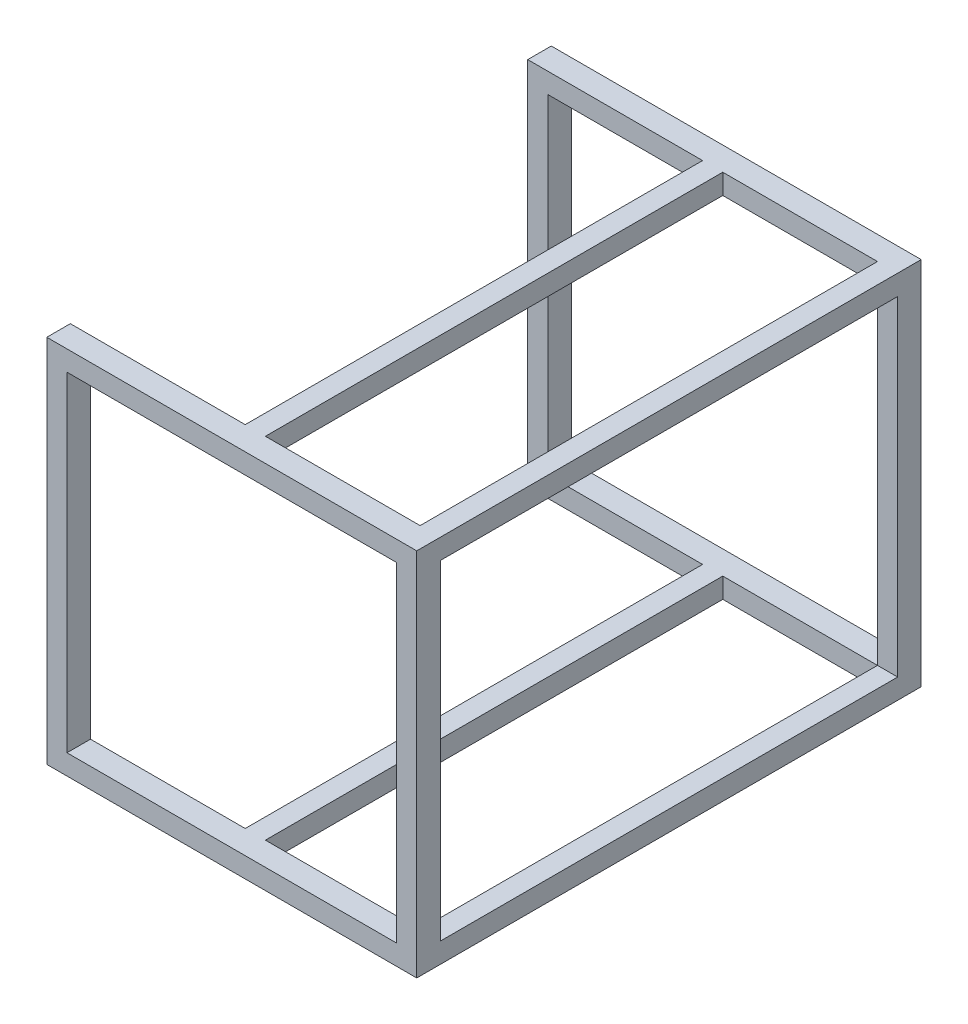
ISO-10303-21;
HEADER;
FILE_DESCRIPTION(('STEP AP214'),'2;1');
FILE_NAME('part.step','',(''),(''),'','','');
FILE_SCHEMA(('AUTOMOTIVE_DESIGN { 1 0 10303 214 1 1 1 1 }'));
ENDSEC;
DATA;
#1=APPLICATION_CONTEXT('core data for automotive mechanical design processes');
#2=APPLICATION_PROTOCOL_DEFINITION('international standard','automotive_design',2000,#1);
#3=PRODUCT_CONTEXT('',#1,'mechanical');
#4=PRODUCT('Part','Part','',(#3));
#5=PRODUCT_RELATED_PRODUCT_CATEGORY('part','',(#4));
#6=PRODUCT_DEFINITION_FORMATION('','',#4);
#7=PRODUCT_DEFINITION_CONTEXT('part definition',#1,'design');
#8=PRODUCT_DEFINITION('design','',#6,#7);
#9=PRODUCT_DEFINITION_SHAPE('','',#8);
#10=(LENGTH_UNIT() NAMED_UNIT(*) SI_UNIT(.MILLI.,.METRE.));
#11=(NAMED_UNIT(*) PLANE_ANGLE_UNIT() SI_UNIT($,.RADIAN.));
#12=(NAMED_UNIT(*) SI_UNIT($,.STERADIAN.) SOLID_ANGLE_UNIT());
#13=UNCERTAINTY_MEASURE_WITH_UNIT(LENGTH_MEASURE(1.E-05),#10,'distance_accuracy_value','');
#14=(GEOMETRIC_REPRESENTATION_CONTEXT(3) GLOBAL_UNCERTAINTY_ASSIGNED_CONTEXT((#13)) GLOBAL_UNIT_ASSIGNED_CONTEXT((#10,
#11,#12)) REPRESENTATION_CONTEXT('',''));
#15=CARTESIAN_POINT('',(0.,0.,0.));
#16=DIRECTION('',(0.,0.,1.));
#17=DIRECTION('',(1.,0.,0.));
#18=AXIS2_PLACEMENT_3D('',#15,#16,#17);
#19=CARTESIAN_POINT('',(49.,49.,0.));
#20=DIRECTION('',(-1.,0.,0.));
#21=DIRECTION('',(0.,0.,1.));
#22=AXIS2_PLACEMENT_3D('',#19,#20,#21);
#23=PLANE('',#22);
#24=DIRECTION('',(0.,0.,-1.));
#25=VECTOR('',#24,1.);
#26=CARTESIAN_POINT('',(49.,55.,0.));
#27=LINE('',#26,#25);
#28=CARTESIAN_POINT('',(49.,55.,143.));
#29=VERTEX_POINT('',#28);
#30=CARTESIAN_POINT('',(49.,55.,7.));
#31=VERTEX_POINT('',#30);
#32=EDGE_CURVE('E225',#29,#31,#27,.T.);
#33=ORIENTED_EDGE('',*,*,#32,.T.);
#34=DIRECTION('',(0.,1.,0.));
#35=VECTOR('',#34,1.);
#36=CARTESIAN_POINT('',(49.,0.,7.));
#37=LINE('',#36,#35);
#38=CARTESIAN_POINT('',(49.,49.,7.));
#39=VERTEX_POINT('',#38);
#40=EDGE_CURVE('E213',#39,#31,#37,.T.);
#41=ORIENTED_EDGE('',*,*,#40,.F.);
#42=DIRECTION('',(0.,0.,-1.));
#43=VECTOR('',#42,1.);
#44=CARTESIAN_POINT('',(49.,49.,0.));
#45=LINE('',#44,#43);
#46=CARTESIAN_POINT('',(49.,49.,143.));
#47=VERTEX_POINT('',#46);
#48=EDGE_CURVE('E194',#47,#39,#45,.T.);
#49=ORIENTED_EDGE('',*,*,#48,.F.);
#50=DIRECTION('',(0.,1.,0.));
#51=VECTOR('',#50,1.);
#52=CARTESIAN_POINT('',(49.,0.,143.));
#53=LINE('',#52,#51);
#54=EDGE_CURVE('E22',#47,#29,#53,.T.);
#55=ORIENTED_EDGE('',*,*,#54,.T.);
#56=EDGE_LOOP('',(#33,#41,#49,#55));
#57=FACE_BOUND('',#56,.T.);
#58=ADVANCED_FACE('F19',(#57),#23,.T.);
#59=CARTESIAN_POINT('',(3.,-55.,143.));
#60=DIRECTION('',(-1.,0.,0.));
#61=DIRECTION('',(0.,0.,1.));
#62=AXIS2_PLACEMENT_3D('',#59,#60,#61);
#63=PLANE('',#62);
#64=DIRECTION('',(0.,0.,-1.));
#65=VECTOR('',#64,1.);
#66=CARTESIAN_POINT('',(3.,55.,0.));
#67=LINE('',#66,#65);
#68=CARTESIAN_POINT('',(3.,55.,7.));
#69=VERTEX_POINT('',#68);
#70=CARTESIAN_POINT('',(3.,55.,143.));
#71=VERTEX_POINT('',#70);
#72=EDGE_CURVE('E250',#69,#71,#67,.F.);
#73=ORIENTED_EDGE('',*,*,#72,.T.);
#74=DIRECTION('',(0.,1.,0.));
#75=VECTOR('',#74,1.);
#76=CARTESIAN_POINT('',(3.,0.,143.));
#77=LINE('',#76,#75);
#78=CARTESIAN_POINT('',(3.,49.,143.));
#79=VERTEX_POINT('',#78);
#80=EDGE_CURVE('E227',#71,#79,#77,.F.);
#81=ORIENTED_EDGE('',*,*,#80,.T.);
#82=DIRECTION('',(0.,0.,-1.));
#83=VECTOR('',#82,1.);
#84=CARTESIAN_POINT('',(3.,49.,0.));
#85=LINE('',#84,#83);
#86=CARTESIAN_POINT('',(3.,49.,7.));
#87=VERTEX_POINT('',#86);
#88=EDGE_CURVE('E425',#87,#79,#85,.F.);
#89=ORIENTED_EDGE('',*,*,#88,.F.);
#90=DIRECTION('',(0.,1.,0.));
#91=VECTOR('',#90,1.);
#92=CARTESIAN_POINT('',(3.,0.,7.));
#93=LINE('',#92,#91);
#94=EDGE_CURVE('E206',#69,#87,#93,.F.);
#95=ORIENTED_EDGE('',*,*,#94,.F.);
#96=EDGE_LOOP('',(#73,#81,#89,#95));
#97=FACE_BOUND('',#96,.T.);
#98=ADVANCED_FACE('F573',(#97),#63,.F.);
#99=CARTESIAN_POINT('',(0.,0.,143.));
#100=DIRECTION('',(0.,0.,1.));
#101=DIRECTION('',(1.,0.,0.));
#102=AXIS2_PLACEMENT_3D('',#99,#100,#101);
#103=PLANE('',#102);
#104=DIRECTION('',(1.,0.,0.));
#105=VECTOR('',#104,1.);
#106=CARTESIAN_POINT('',(-55.,55.,143.));
#107=LINE('',#106,#105);
#108=EDGE_CURVE('E434',#71,#29,#107,.T.);
#109=ORIENTED_EDGE('',*,*,#108,.T.);
#110=ORIENTED_EDGE('',*,*,#54,.F.);
#111=DIRECTION('',(1.,0.,0.));
#112=VECTOR('',#111,1.);
#113=CARTESIAN_POINT('',(-49.,49.,143.));
#114=LINE('',#113,#112);
#115=EDGE_CURVE('E421',#79,#47,#114,.T.);
#116=ORIENTED_EDGE('',*,*,#115,.F.);
#117=ORIENTED_EDGE('',*,*,#80,.F.);
#118=EDGE_LOOP('',(#109,#110,#116,#117));
#119=FACE_BOUND('',#118,.T.);
#120=ADVANCED_FACE('F578',(#119),#103,.F.);
#121=CARTESIAN_POINT('',(0.,0.,7.));
#122=DIRECTION('',(0.,0.,1.));
#123=DIRECTION('',(1.,0.,0.));
#124=AXIS2_PLACEMENT_3D('',#121,#122,#123);
#125=PLANE('',#124);
#126=DIRECTION('',(1.,0.,0.));
#127=VECTOR('',#126,1.);
#128=CARTESIAN_POINT('',(-55.,55.,7.));
#129=LINE('',#128,#127);
#130=EDGE_CURVE('E428',#31,#69,#129,.F.);
#131=ORIENTED_EDGE('',*,*,#130,.T.);
#132=ORIENTED_EDGE('',*,*,#94,.T.);
#133=DIRECTION('',(1.,0.,0.));
#134=VECTOR('',#133,1.);
#135=CARTESIAN_POINT('',(-49.,49.,7.));
#136=LINE('',#135,#134);
#137=EDGE_CURVE('E210',#39,#87,#136,.F.);
#138=ORIENTED_EDGE('',*,*,#137,.F.);
#139=ORIENTED_EDGE('',*,*,#40,.T.);
#140=EDGE_LOOP('',(#131,#132,#138,#139));
#141=FACE_BOUND('',#140,.T.);
#142=ADVANCED_FACE('F212',(#141),#125,.T.);
#143=CARTESIAN_POINT('',(49.,49.,0.));
#144=DIRECTION('',(-1.,0.,0.));
#145=DIRECTION('',(0.,0.,1.));
#146=AXIS2_PLACEMENT_3D('',#143,#144,#145);
#147=PLANE('',#146);
#148=DIRECTION('',(0.,0.,-1.));
#149=VECTOR('',#148,1.);
#150=CARTESIAN_POINT('',(49.,49.,0.));
#151=LINE('',#150,#149);
#152=CARTESIAN_POINT('',(49.,49.,150.));
#153=VERTEX_POINT('',#152);
#154=EDGE_CURVE('E418',#47,#153,#151,.F.);
#155=ORIENTED_EDGE('',*,*,#154,.F.);
#156=DIRECTION('',(0.,1.,0.));
#157=VECTOR('',#156,1.);
#158=CARTESIAN_POINT('',(49.,0.,143.));
#159=LINE('',#158,#157);
#160=CARTESIAN_POINT('',(49.,-49.,143.));
#161=VERTEX_POINT('',#160);
#162=EDGE_CURVE('E251',#47,#161,#159,.F.);
#163=ORIENTED_EDGE('',*,*,#162,.T.);
#164=DIRECTION('',(0.,0.,1.));
#165=VECTOR('',#164,1.);
#166=CARTESIAN_POINT('',(49.,-49.,0.));
#167=LINE('',#166,#165);
#168=CARTESIAN_POINT('',(49.,-49.,150.));
#169=VERTEX_POINT('',#168);
#170=EDGE_CURVE('E447',#169,#161,#167,.F.);
#171=ORIENTED_EDGE('',*,*,#170,.F.);
#172=DIRECTION('',(0.,1.,0.));
#173=VECTOR('',#172,1.);
#174=CARTESIAN_POINT('',(49.,0.,150.));
#175=LINE('',#174,#173);
#176=EDGE_CURVE('E381',#153,#169,#175,.F.);
#177=ORIENTED_EDGE('',*,*,#176,.F.);
#178=EDGE_LOOP('',(#155,#163,#171,#177));
#179=FACE_BOUND('',#178,.T.);
#180=ADVANCED_FACE('F445',(#179),#147,.T.);
#181=CARTESIAN_POINT('',(0.,0.,7.));
#182=DIRECTION('',(0.,0.,1.));
#183=DIRECTION('',(1.,0.,0.));
#184=AXIS2_PLACEMENT_3D('',#181,#182,#183);
#185=PLANE('',#184);
#186=DIRECTION('',(0.,1.,0.));
#187=VECTOR('',#186,1.);
#188=CARTESIAN_POINT('',(49.,49.,7.));
#189=LINE('',#188,#187);
#190=CARTESIAN_POINT('',(49.,-49.,7.));
#191=VERTEX_POINT('',#190);
#192=EDGE_CURVE('E242',#191,#39,#189,.T.);
#193=ORIENTED_EDGE('',*,*,#192,.F.);
#194=DIRECTION('',(1.,0.,0.));
#195=VECTOR('',#194,1.);
#196=CARTESIAN_POINT('',(49.,-49.,7.));
#197=LINE('',#196,#195);
#198=CARTESIAN_POINT('',(55.,-49.,7.));
#199=VERTEX_POINT('',#198);
#200=EDGE_CURVE('E466',#199,#191,#197,.F.);
#201=ORIENTED_EDGE('',*,*,#200,.F.);
#202=DIRECTION('',(0.,1.,0.));
#203=VECTOR('',#202,1.);
#204=CARTESIAN_POINT('',(55.,55.,7.));
#205=LINE('',#204,#203);
#206=CARTESIAN_POINT('',(55.,49.,7.));
#207=VERTEX_POINT('',#206);
#208=EDGE_CURVE('E255',#199,#207,#205,.T.);
#209=ORIENTED_EDGE('',*,*,#208,.T.);
#210=DIRECTION('',(1.,0.,0.));
#211=VECTOR('',#210,1.);
#212=CARTESIAN_POINT('',(-49.,49.,7.));
#213=LINE('',#212,#211);
#214=EDGE_CURVE('E199',#39,#207,#213,.T.);
#215=ORIENTED_EDGE('',*,*,#214,.F.);
#216=EDGE_LOOP('',(#193,#201,#209,#215));
#217=FACE_BOUND('',#216,.T.);
#218=ADVANCED_FACE('F254',(#217),#185,.T.);
#219=CARTESIAN_POINT('',(-49.,49.,0.));
#220=DIRECTION('',(0.,-1.,0.));
#221=DIRECTION('',(0.,0.,-1.));
#222=AXIS2_PLACEMENT_3D('',#219,#220,#221);
#223=PLANE('',#222);
#224=ORIENTED_EDGE('',*,*,#48,.T.);
#225=ORIENTED_EDGE('',*,*,#214,.T.);
#226=DIRECTION('',(0.,0.,1.));
#227=VECTOR('',#226,1.);
#228=CARTESIAN_POINT('',(55.,49.,0.));
#229=LINE('',#228,#227);
#230=CARTESIAN_POINT('',(55.,49.,143.));
#231=VERTEX_POINT('',#230);
#232=EDGE_CURVE('E551',#207,#231,#229,.T.);
#233=ORIENTED_EDGE('',*,*,#232,.T.);
#234=DIRECTION('',(1.,0.,0.));
#235=VECTOR('',#234,1.);
#236=CARTESIAN_POINT('',(0.,49.,143.));
#237=LINE('',#236,#235);
#238=EDGE_CURVE('E201',#231,#47,#237,.F.);
#239=ORIENTED_EDGE('',*,*,#238,.T.);
#240=EDGE_LOOP('',(#224,#225,#233,#239));
#241=FACE_BOUND('',#240,.T.);
#242=ADVANCED_FACE('F196',(#241),#223,.T.);
#243=CARTESIAN_POINT('',(0.,0.,143.));
#244=DIRECTION('',(0.,0.,1.));
#245=DIRECTION('',(1.,0.,0.));
#246=AXIS2_PLACEMENT_3D('',#243,#244,#245);
#247=PLANE('',#246);
#248=ORIENTED_EDGE('',*,*,#162,.F.);
#249=ORIENTED_EDGE('',*,*,#238,.F.);
#250=DIRECTION('',(0.,1.,0.));
#251=VECTOR('',#250,1.);
#252=CARTESIAN_POINT('',(55.,55.,143.));
#253=LINE('',#252,#251);
#254=CARTESIAN_POINT('',(55.,-49.,143.));
#255=VERTEX_POINT('',#254);
#256=EDGE_CURVE('E461',#231,#255,#253,.F.);
#257=ORIENTED_EDGE('',*,*,#256,.T.);
#258=DIRECTION('',(1.,0.,0.));
#259=VECTOR('',#258,1.);
#260=CARTESIAN_POINT('',(49.,-49.,143.));
#261=LINE('',#260,#259);
#262=EDGE_CURVE('E408',#161,#255,#261,.T.);
#263=ORIENTED_EDGE('',*,*,#262,.F.);
#264=EDGE_LOOP('',(#248,#249,#257,#263));
#265=FACE_BOUND('',#264,.T.);
#266=ADVANCED_FACE('F459',(#265),#247,.F.);
#267=CARTESIAN_POINT('',(49.,49.,0.));
#268=DIRECTION('',(-1.,0.,0.));
#269=DIRECTION('',(0.,0.,1.));
#270=AXIS2_PLACEMENT_3D('',#267,#268,#269);
#271=PLANE('',#270);
#272=DIRECTION('',(0.,1.,0.));
#273=VECTOR('',#272,1.);
#274=CARTESIAN_POINT('',(49.,0.,0.));
#275=LINE('',#274,#273);
#276=CARTESIAN_POINT('',(49.,49.,0.));
#277=VERTEX_POINT('',#276);
#278=CARTESIAN_POINT('',(49.,-49.,0.));
#279=VERTEX_POINT('',#278);
#280=EDGE_CURVE('E536',#277,#279,#275,.F.);
#281=ORIENTED_EDGE('',*,*,#280,.T.);
#282=DIRECTION('',(0.,0.,1.));
#283=VECTOR('',#282,1.);
#284=CARTESIAN_POINT('',(49.,-49.,0.));
#285=LINE('',#284,#283);
#286=EDGE_CURVE('E244',#191,#279,#285,.F.);
#287=ORIENTED_EDGE('',*,*,#286,.F.);
#288=ORIENTED_EDGE('',*,*,#192,.T.);
#289=DIRECTION('',(0.,0.,-1.));
#290=VECTOR('',#289,1.);
#291=CARTESIAN_POINT('',(49.,49.,0.));
#292=LINE('',#291,#290);
#293=EDGE_CURVE('E221',#277,#39,#292,.F.);
#294=ORIENTED_EDGE('',*,*,#293,.F.);
#295=EDGE_LOOP('',(#281,#287,#288,#294));
#296=FACE_BOUND('',#295,.T.);
#297=ADVANCED_FACE('F243',(#296),#271,.T.);
#298=CARTESIAN_POINT('',(-49.,-49.,0.));
#299=DIRECTION('',(1.,0.,0.));
#300=DIRECTION('',(0.,0.,-1.));
#301=AXIS2_PLACEMENT_3D('',#298,#299,#300);
#302=PLANE('',#301);
#303=DIRECTION('',(0.,1.,0.));
#304=VECTOR('',#303,1.);
#305=CARTESIAN_POINT('',(-49.,0.,0.));
#306=LINE('',#305,#304);
#307=CARTESIAN_POINT('',(-49.,-49.,0.));
#308=VERTEX_POINT('',#307);
#309=CARTESIAN_POINT('',(-49.,49.,0.));
#310=VERTEX_POINT('',#309);
#311=EDGE_CURVE('E529',#308,#310,#306,.T.);
#312=ORIENTED_EDGE('',*,*,#311,.T.);
#313=DIRECTION('',(0.,0.,-1.));
#314=VECTOR('',#313,1.);
#315=CARTESIAN_POINT('',(-49.,49.,0.));
#316=LINE('',#315,#314);
#317=CARTESIAN_POINT('',(-49.,49.,7.));
#318=VERTEX_POINT('',#317);
#319=EDGE_CURVE('E238',#318,#310,#316,.T.);
#320=ORIENTED_EDGE('',*,*,#319,.F.);
#321=DIRECTION('',(0.,1.,0.));
#322=VECTOR('',#321,1.);
#323=CARTESIAN_POINT('',(-49.,0.,7.));
#324=LINE('',#323,#322);
#325=CARTESIAN_POINT('',(-49.,-49.,7.));
#326=VERTEX_POINT('',#325);
#327=EDGE_CURVE('E327',#326,#318,#324,.T.);
#328=ORIENTED_EDGE('',*,*,#327,.F.);
#329=DIRECTION('',(0.,0.,1.));
#330=VECTOR('',#329,1.);
#331=CARTESIAN_POINT('',(-49.,-49.,0.));
#332=LINE('',#331,#330);
#333=EDGE_CURVE('E394',#308,#326,#332,.T.);
#334=ORIENTED_EDGE('',*,*,#333,.F.);
#335=EDGE_LOOP('',(#312,#320,#328,#334));
#336=FACE_BOUND('',#335,.T.);
#337=ADVANCED_FACE('F608',(#336),#302,.T.);
#338=CARTESIAN_POINT('',(-55.,55.,0.));
#339=DIRECTION('',(0.,-1.,0.));
#340=DIRECTION('',(0.,0.,-1.));
#341=AXIS2_PLACEMENT_3D('',#338,#339,#340);
#342=PLANE('',#341);
#343=ORIENTED_EDGE('',*,*,#32,.F.);
#344=ORIENTED_EDGE('',*,*,#108,.F.);
#345=ORIENTED_EDGE('',*,*,#72,.F.);
#346=ORIENTED_EDGE('',*,*,#130,.F.);
#347=EDGE_LOOP('',(#343,#344,#345,#346));
#348=FACE_BOUND('',#347,.T.);
#349=DIRECTION('',(1.,0.,0.));
#350=VECTOR('',#349,1.);
#351=CARTESIAN_POINT('',(0.,55.,143.));
#352=LINE('',#351,#350);
#353=CARTESIAN_POINT('',(-3.,55.,143.));
#354=VERTEX_POINT('',#353);
#355=CARTESIAN_POINT('',(-55.,55.,143.));
#356=VERTEX_POINT('',#355);
#357=EDGE_CURVE('E308',#354,#356,#352,.F.);
#358=ORIENTED_EDGE('',*,*,#357,.T.);
#359=DIRECTION('',(0.,0.,-1.));
#360=VECTOR('',#359,1.);
#361=CARTESIAN_POINT('',(-55.,55.,0.));
#362=LINE('',#361,#360);
#363=CARTESIAN_POINT('',(-55.,55.,150.));
#364=VERTEX_POINT('',#363);
#365=EDGE_CURVE('E390',#356,#364,#362,.F.);
#366=ORIENTED_EDGE('',*,*,#365,.T.);
#367=DIRECTION('',(1.,0.,0.));
#368=VECTOR('',#367,1.);
#369=CARTESIAN_POINT('',(0.,55.,150.));
#370=LINE('',#369,#368);
#371=CARTESIAN_POINT('',(55.,55.,150.));
#372=VERTEX_POINT('',#371);
#373=EDGE_CURVE('E387',#372,#364,#370,.F.);
#374=ORIENTED_EDGE('',*,*,#373,.F.);
#375=DIRECTION('',(0.,0.,1.));
#376=VECTOR('',#375,1.);
#377=CARTESIAN_POINT('',(55.,55.,0.));
#378=LINE('',#377,#376);
#379=CARTESIAN_POINT('',(55.,55.,0.));
#380=VERTEX_POINT('',#379);
#381=EDGE_CURVE('E556',#372,#380,#378,.F.);
#382=ORIENTED_EDGE('',*,*,#381,.T.);
#383=DIRECTION('',(1.,0.,0.));
#384=VECTOR('',#383,1.);
#385=CARTESIAN_POINT('',(0.,55.,0.));
#386=LINE('',#385,#384);
#387=CARTESIAN_POINT('',(-55.,55.,0.));
#388=VERTEX_POINT('',#387);
#389=EDGE_CURVE('E543',#380,#388,#386,.F.);
#390=ORIENTED_EDGE('',*,*,#389,.T.);
#391=DIRECTION('',(0.,0.,-1.));
#392=VECTOR('',#391,1.);
#393=CARTESIAN_POINT('',(-55.,55.,0.));
#394=LINE('',#393,#392);
#395=CARTESIAN_POINT('',(-55.,55.,7.));
#396=VERTEX_POINT('',#395);
#397=EDGE_CURVE('E520',#388,#396,#394,.F.);
#398=ORIENTED_EDGE('',*,*,#397,.T.);
#399=DIRECTION('',(1.,0.,0.));
#400=VECTOR('',#399,1.);
#401=CARTESIAN_POINT('',(0.,55.,7.));
#402=LINE('',#401,#400);
#403=CARTESIAN_POINT('',(-3.,55.,7.));
#404=VERTEX_POINT('',#403);
#405=EDGE_CURVE('E517',#404,#396,#402,.F.);
#406=ORIENTED_EDGE('',*,*,#405,.F.);
#407=DIRECTION('',(0.,0.,-1.));
#408=VECTOR('',#407,1.);
#409=CARTESIAN_POINT('',(-3.,55.,143.));
#410=LINE('',#409,#408);
#411=EDGE_CURVE('E220',#404,#354,#410,.F.);
#412=ORIENTED_EDGE('',*,*,#411,.T.);
#413=EDGE_LOOP('',(#358,#366,#374,#382,#390,#398,#406,#412));
#414=FACE_BOUND('',#413,.T.);
#415=ADVANCED_FACE('F576',(#348,#414),#342,.F.);
#416=CARTESIAN_POINT('',(-49.,-49.,0.));
#417=DIRECTION('',(1.,0.,0.));
#418=DIRECTION('',(0.,0.,-1.));
#419=AXIS2_PLACEMENT_3D('',#416,#417,#418);
#420=PLANE('',#419);
#421=DIRECTION('',(0.,0.,1.));
#422=VECTOR('',#421,1.);
#423=CARTESIAN_POINT('',(-49.,-49.,0.));
#424=LINE('',#423,#422);
#425=CARTESIAN_POINT('',(-49.,-49.,143.));
#426=VERTEX_POINT('',#425);
#427=CARTESIAN_POINT('',(-49.,-49.,150.));
#428=VERTEX_POINT('',#427);
#429=EDGE_CURVE('E456',#426,#428,#424,.T.);
#430=ORIENTED_EDGE('',*,*,#429,.F.);
#431=DIRECTION('',(0.,1.,0.));
#432=VECTOR('',#431,1.);
#433=CARTESIAN_POINT('',(-49.,0.,143.));
#434=LINE('',#433,#432);
#435=CARTESIAN_POINT('',(-49.,49.,143.));
#436=VERTEX_POINT('',#435);
#437=EDGE_CURVE('E292',#426,#436,#434,.T.);
#438=ORIENTED_EDGE('',*,*,#437,.T.);
#439=DIRECTION('',(0.,0.,-1.));
#440=VECTOR('',#439,1.);
#441=CARTESIAN_POINT('',(-49.,49.,0.));
#442=LINE('',#441,#440);
#443=CARTESIAN_POINT('',(-49.,49.,150.));
#444=VERTEX_POINT('',#443);
#445=EDGE_CURVE('E415',#444,#436,#442,.T.);
#446=ORIENTED_EDGE('',*,*,#445,.F.);
#447=DIRECTION('',(0.,1.,0.));
#448=VECTOR('',#447,1.);
#449=CARTESIAN_POINT('',(-49.,0.,150.));
#450=LINE('',#449,#448);
#451=EDGE_CURVE('E370',#428,#444,#450,.T.);
#452=ORIENTED_EDGE('',*,*,#451,.F.);
#453=EDGE_LOOP('',(#430,#438,#446,#452));
#454=FACE_BOUND('',#453,.T.);
#455=ADVANCED_FACE('F589',(#454),#420,.T.);
#456=CARTESIAN_POINT('',(-49.,49.,0.));
#457=DIRECTION('',(0.,-1.,0.));
#458=DIRECTION('',(0.,0.,-1.));
#459=AXIS2_PLACEMENT_3D('',#456,#457,#458);
#460=PLANE('',#459);
#461=ORIENTED_EDGE('',*,*,#293,.T.);
#462=ORIENTED_EDGE('',*,*,#137,.T.);
#463=ORIENTED_EDGE('',*,*,#88,.T.);
#464=ORIENTED_EDGE('',*,*,#115,.T.);
#465=ORIENTED_EDGE('',*,*,#154,.T.);
#466=DIRECTION('',(1.,0.,0.));
#467=VECTOR('',#466,1.);
#468=CARTESIAN_POINT('',(0.,49.,150.));
#469=LINE('',#468,#467);
#470=EDGE_CURVE('E375',#444,#153,#469,.T.);
#471=ORIENTED_EDGE('',*,*,#470,.F.);
#472=ORIENTED_EDGE('',*,*,#445,.T.);
#473=DIRECTION('',(1.,0.,0.));
#474=VECTOR('',#473,1.);
#475=CARTESIAN_POINT('',(0.,49.,143.));
#476=LINE('',#475,#474);
#477=CARTESIAN_POINT('',(-3.,49.,143.));
#478=VERTEX_POINT('',#477);
#479=EDGE_CURVE('E287',#436,#478,#476,.T.);
#480=ORIENTED_EDGE('',*,*,#479,.T.);
#481=DIRECTION('',(0.,0.,-1.));
#482=VECTOR('',#481,1.);
#483=CARTESIAN_POINT('',(-3.,49.,143.));
#484=LINE('',#483,#482);
#485=CARTESIAN_POINT('',(-3.,49.,7.));
#486=VERTEX_POINT('',#485);
#487=EDGE_CURVE('E402',#478,#486,#484,.T.);
#488=ORIENTED_EDGE('',*,*,#487,.T.);
#489=DIRECTION('',(1.,0.,0.));
#490=VECTOR('',#489,1.);
#491=CARTESIAN_POINT('',(0.,49.,7.));
#492=LINE('',#491,#490);
#493=EDGE_CURVE('E323',#318,#486,#492,.T.);
#494=ORIENTED_EDGE('',*,*,#493,.F.);
#495=ORIENTED_EDGE('',*,*,#319,.T.);
#496=DIRECTION('',(1.,0.,0.));
#497=VECTOR('',#496,1.);
#498=CARTESIAN_POINT('',(0.,49.,0.));
#499=LINE('',#498,#497);
#500=EDGE_CURVE('E234',#310,#277,#499,.T.);
#501=ORIENTED_EDGE('',*,*,#500,.T.);
#502=EDGE_LOOP('',(#461,#462,#463,#464,#465,#471,#472,#480,#488,#494,#495,#501));
#503=FACE_BOUND('',#502,.T.);
#504=ADVANCED_FACE('F232',(#503),#460,.T.);
#505=CARTESIAN_POINT('',(-3.,-49.,143.));
#506=DIRECTION('',(1.,0.,0.));
#507=DIRECTION('',(0.,0.,-1.));
#508=AXIS2_PLACEMENT_3D('',#505,#506,#507);
#509=PLANE('',#508);
#510=ORIENTED_EDGE('',*,*,#487,.F.);
#511=DIRECTION('',(0.,1.,0.));
#512=VECTOR('',#511,1.);
#513=CARTESIAN_POINT('',(-3.,0.,143.));
#514=LINE('',#513,#512);
#515=EDGE_CURVE('E284',#478,#354,#514,.T.);
#516=ORIENTED_EDGE('',*,*,#515,.T.);
#517=ORIENTED_EDGE('',*,*,#411,.F.);
#518=DIRECTION('',(0.,1.,0.));
#519=VECTOR('',#518,1.);
#520=CARTESIAN_POINT('',(-3.,0.,7.));
#521=LINE('',#520,#519);
#522=EDGE_CURVE('E319',#486,#404,#521,.T.);
#523=ORIENTED_EDGE('',*,*,#522,.F.);
#524=EDGE_LOOP('',(#510,#516,#517,#523));
#525=FACE_BOUND('',#524,.T.);
#526=ADVANCED_FACE('F598',(#525),#509,.F.);
#527=CARTESIAN_POINT('',(49.,-49.,0.));
#528=DIRECTION('',(0.,1.,0.));
#529=DIRECTION('',(0.,0.,1.));
#530=AXIS2_PLACEMENT_3D('',#527,#528,#529);
#531=PLANE('',#530);
#532=DIRECTION('',(0.,0.,1.));
#533=VECTOR('',#532,1.);
#534=CARTESIAN_POINT('',(55.,-49.,0.));
#535=LINE('',#534,#533);
#536=EDGE_CURVE('E546',#255,#199,#535,.F.);
#537=ORIENTED_EDGE('',*,*,#536,.T.);
#538=ORIENTED_EDGE('',*,*,#200,.T.);
#539=DIRECTION('',(0.,0.,1.));
#540=VECTOR('',#539,1.);
#541=CARTESIAN_POINT('',(49.,-49.,0.));
#542=LINE('',#541,#540);
#543=EDGE_CURVE('E280',#161,#191,#542,.F.);
#544=ORIENTED_EDGE('',*,*,#543,.F.);
#545=ORIENTED_EDGE('',*,*,#262,.T.);
#546=EDGE_LOOP('',(#537,#538,#544,#545));
#547=FACE_BOUND('',#546,.T.);
#548=ADVANCED_FACE('F467',(#547),#531,.T.);
#549=CARTESIAN_POINT('',(49.,-49.,0.));
#550=DIRECTION('',(0.,1.,0.));
#551=DIRECTION('',(0.,0.,1.));
#552=AXIS2_PLACEMENT_3D('',#549,#550,#551);
#553=PLANE('',#552);
#554=ORIENTED_EDGE('',*,*,#333,.T.);
#555=DIRECTION('',(1.,0.,0.));
#556=VECTOR('',#555,1.);
#557=CARTESIAN_POINT('',(0.,-49.,7.));
#558=LINE('',#557,#556);
#559=CARTESIAN_POINT('',(-3.,-49.,7.));
#560=VERTEX_POINT('',#559);
#561=EDGE_CURVE('E512',#560,#326,#558,.F.);
#562=ORIENTED_EDGE('',*,*,#561,.F.);
#563=DIRECTION('',(0.,0.,-1.));
#564=VECTOR('',#563,1.);
#565=CARTESIAN_POINT('',(-3.,-49.,143.));
#566=LINE('',#565,#564);
#567=CARTESIAN_POINT('',(-3.,-49.,143.));
#568=VERTEX_POINT('',#567);
#569=EDGE_CURVE('E316',#560,#568,#566,.F.);
#570=ORIENTED_EDGE('',*,*,#569,.T.);
#571=DIRECTION('',(1.,0.,0.));
#572=VECTOR('',#571,1.);
#573=CARTESIAN_POINT('',(0.,-49.,143.));
#574=LINE('',#573,#572);
#575=EDGE_CURVE('E296',#568,#426,#574,.F.);
#576=ORIENTED_EDGE('',*,*,#575,.T.);
#577=ORIENTED_EDGE('',*,*,#429,.T.);
#578=DIRECTION('',(1.,0.,0.));
#579=VECTOR('',#578,1.);
#580=CARTESIAN_POINT('',(0.,-49.,150.));
#581=LINE('',#580,#579);
#582=EDGE_CURVE('E376',#169,#428,#581,.F.);
#583=ORIENTED_EDGE('',*,*,#582,.F.);
#584=ORIENTED_EDGE('',*,*,#170,.T.);
#585=DIRECTION('',(1.,0.,0.));
#586=VECTOR('',#585,1.);
#587=CARTESIAN_POINT('',(0.,-49.,143.));
#588=LINE('',#587,#586);
#589=CARTESIAN_POINT('',(3.,-49.,143.));
#590=VERTEX_POINT('',#589);
#591=EDGE_CURVE('E279',#161,#590,#588,.F.);
#592=ORIENTED_EDGE('',*,*,#591,.T.);
#593=DIRECTION('',(0.,0.,1.));
#594=VECTOR('',#593,1.);
#595=CARTESIAN_POINT('',(3.,-49.,143.));
#596=LINE('',#595,#594);
#597=CARTESIAN_POINT('',(3.,-49.,7.));
#598=VERTEX_POINT('',#597);
#599=EDGE_CURVE('E502',#590,#598,#596,.F.);
#600=ORIENTED_EDGE('',*,*,#599,.T.);
#601=DIRECTION('',(1.,0.,0.));
#602=VECTOR('',#601,1.);
#603=CARTESIAN_POINT('',(0.,-49.,7.));
#604=LINE('',#603,#602);
#605=EDGE_CURVE('E498',#191,#598,#604,.F.);
#606=ORIENTED_EDGE('',*,*,#605,.F.);
#607=ORIENTED_EDGE('',*,*,#286,.T.);
#608=DIRECTION('',(1.,0.,0.));
#609=VECTOR('',#608,1.);
#610=CARTESIAN_POINT('',(0.,-49.,0.));
#611=LINE('',#610,#609);
#612=EDGE_CURVE('E533',#279,#308,#611,.F.);
#613=ORIENTED_EDGE('',*,*,#612,.T.);
#614=EDGE_LOOP('',(#554,#562,#570,#576,#577,#583,#584,#592,#600,#606,#607,#613));
#615=FACE_BOUND('',#614,.T.);
#616=ADVANCED_FACE('F452',(#615),#553,.T.);
#617=CARTESIAN_POINT('',(-55.,-55.,0.));
#618=DIRECTION('',(1.,0.,0.));
#619=DIRECTION('',(0.,0.,-1.));
#620=AXIS2_PLACEMENT_3D('',#617,#618,#619);
#621=PLANE('',#620);
#622=DIRECTION('',(0.,0.,1.));
#623=VECTOR('',#622,1.);
#624=CARTESIAN_POINT('',(-55.,-55.,0.));
#625=LINE('',#624,#623);
#626=CARTESIAN_POINT('',(-55.,-55.,143.));
#627=VERTEX_POINT('',#626);
#628=CARTESIAN_POINT('',(-55.,-55.,150.));
#629=VERTEX_POINT('',#628);
#630=EDGE_CURVE('E363',#627,#629,#625,.T.);
#631=ORIENTED_EDGE('',*,*,#630,.T.);
#632=DIRECTION('',(0.,1.,0.));
#633=VECTOR('',#632,1.);
#634=CARTESIAN_POINT('',(-55.,0.,150.));
#635=LINE('',#634,#633);
#636=EDGE_CURVE('E384',#364,#629,#635,.F.);
#637=ORIENTED_EDGE('',*,*,#636,.F.);
#638=ORIENTED_EDGE('',*,*,#365,.F.);
#639=DIRECTION('',(0.,1.,0.));
#640=VECTOR('',#639,1.);
#641=CARTESIAN_POINT('',(-55.,0.,143.));
#642=LINE('',#641,#640);
#643=EDGE_CURVE('E304',#356,#627,#642,.F.);
#644=ORIENTED_EDGE('',*,*,#643,.T.);
#645=EDGE_LOOP('',(#631,#637,#638,#644));
#646=FACE_BOUND('',#645,.T.);
#647=ADVANCED_FACE('F633',(#646),#621,.F.);
#648=CARTESIAN_POINT('',(0.,0.,150.));
#649=DIRECTION('',(0.,0.,1.));
#650=DIRECTION('',(1.,0.,0.));
#651=AXIS2_PLACEMENT_3D('',#648,#649,#650);
#652=PLANE('',#651);
#653=ORIENTED_EDGE('',*,*,#451,.T.);
#654=ORIENTED_EDGE('',*,*,#470,.T.);
#655=ORIENTED_EDGE('',*,*,#176,.T.);
#656=ORIENTED_EDGE('',*,*,#582,.T.);
#657=EDGE_LOOP('',(#653,#654,#655,#656));
#658=FACE_BOUND('',#657,.T.);
#659=DIRECTION('',(1.,0.,0.));
#660=VECTOR('',#659,1.);
#661=CARTESIAN_POINT('',(55.,-55.,150.));
#662=LINE('',#661,#660);
#663=CARTESIAN_POINT('',(55.,-55.,150.));
#664=VERTEX_POINT('',#663);
#665=EDGE_CURVE('E358',#629,#664,#662,.T.);
#666=ORIENTED_EDGE('',*,*,#665,.T.);
#667=DIRECTION('',(0.,1.,0.));
#668=VECTOR('',#667,1.);
#669=CARTESIAN_POINT('',(55.,55.,150.));
#670=LINE('',#669,#668);
#671=EDGE_CURVE('E560',#664,#372,#670,.T.);
#672=ORIENTED_EDGE('',*,*,#671,.T.);
#673=ORIENTED_EDGE('',*,*,#373,.T.);
#674=ORIENTED_EDGE('',*,*,#636,.T.);
#675=EDGE_LOOP('',(#666,#672,#673,#674));
#676=FACE_BOUND('',#675,.T.);
#677=ADVANCED_FACE('F584',(#658,#676),#652,.T.);
#678=CARTESIAN_POINT('',(55.,55.,0.));
#679=DIRECTION('',(-1.,0.,0.));
#680=DIRECTION('',(0.,0.,1.));
#681=AXIS2_PLACEMENT_3D('',#678,#679,#680);
#682=PLANE('',#681);
#683=ORIENTED_EDGE('',*,*,#256,.F.);
#684=ORIENTED_EDGE('',*,*,#232,.F.);
#685=ORIENTED_EDGE('',*,*,#208,.F.);
#686=ORIENTED_EDGE('',*,*,#536,.F.);
#687=EDGE_LOOP('',(#683,#684,#685,#686));
#688=FACE_BOUND('',#687,.T.);
#689=ORIENTED_EDGE('',*,*,#381,.F.);
#690=ORIENTED_EDGE('',*,*,#671,.F.);
#691=DIRECTION('',(0.,0.,1.));
#692=VECTOR('',#691,1.);
#693=CARTESIAN_POINT('',(55.,-55.,0.));
#694=LINE('',#693,#692);
#695=CARTESIAN_POINT('',(55.,-55.,0.));
#696=VERTEX_POINT('',#695);
#697=EDGE_CURVE('E354',#664,#696,#694,.F.);
#698=ORIENTED_EDGE('',*,*,#697,.T.);
#699=DIRECTION('',(0.,1.,0.));
#700=VECTOR('',#699,1.);
#701=CARTESIAN_POINT('',(55.,0.,0.));
#702=LINE('',#701,#700);
#703=EDGE_CURVE('E539',#696,#380,#702,.T.);
#704=ORIENTED_EDGE('',*,*,#703,.T.);
#705=EDGE_LOOP('',(#689,#690,#698,#704));
#706=FACE_BOUND('',#705,.T.);
#707=ADVANCED_FACE('F632',(#688,#706),#682,.F.);
#708=CARTESIAN_POINT('',(0.,0.,0.));
#709=DIRECTION('',(0.,0.,1.));
#710=DIRECTION('',(1.,0.,0.));
#711=AXIS2_PLACEMENT_3D('',#708,#709,#710);
#712=PLANE('',#711);
#713=ORIENTED_EDGE('',*,*,#311,.F.);
#714=ORIENTED_EDGE('',*,*,#612,.F.);
#715=ORIENTED_EDGE('',*,*,#280,.F.);
#716=ORIENTED_EDGE('',*,*,#500,.F.);
#717=EDGE_LOOP('',(#713,#714,#715,#716));
#718=FACE_BOUND('',#717,.T.);
#719=DIRECTION('',(1.,0.,0.));
#720=VECTOR('',#719,1.);
#721=CARTESIAN_POINT('',(55.,-55.,0.));
#722=LINE('',#721,#720);
#723=CARTESIAN_POINT('',(-55.,-55.,0.));
#724=VERTEX_POINT('',#723);
#725=EDGE_CURVE('E350',#696,#724,#722,.F.);
#726=ORIENTED_EDGE('',*,*,#725,.T.);
#727=DIRECTION('',(0.,1.,0.));
#728=VECTOR('',#727,1.);
#729=CARTESIAN_POINT('',(-55.,-55.,0.));
#730=LINE('',#729,#728);
#731=EDGE_CURVE('E524',#724,#388,#730,.T.);
#732=ORIENTED_EDGE('',*,*,#731,.T.);
#733=ORIENTED_EDGE('',*,*,#389,.F.);
#734=ORIENTED_EDGE('',*,*,#703,.F.);
#735=EDGE_LOOP('',(#726,#732,#733,#734));
#736=FACE_BOUND('',#735,.T.);
#737=ADVANCED_FACE('F612',(#718,#736),#712,.F.);
#738=CARTESIAN_POINT('',(-55.,-55.,0.));
#739=DIRECTION('',(1.,0.,0.));
#740=DIRECTION('',(0.,0.,-1.));
#741=AXIS2_PLACEMENT_3D('',#738,#739,#740);
#742=PLANE('',#741);
#743=ORIENTED_EDGE('',*,*,#731,.F.);
#744=DIRECTION('',(0.,0.,1.));
#745=VECTOR('',#744,1.);
#746=CARTESIAN_POINT('',(-55.,-55.,0.));
#747=LINE('',#746,#745);
#748=CARTESIAN_POINT('',(-55.,-55.,7.));
#749=VERTEX_POINT('',#748);
#750=EDGE_CURVE('E346',#724,#749,#747,.T.);
#751=ORIENTED_EDGE('',*,*,#750,.T.);
#752=DIRECTION('',(0.,1.,0.));
#753=VECTOR('',#752,1.);
#754=CARTESIAN_POINT('',(-55.,0.,7.));
#755=LINE('',#754,#753);
#756=EDGE_CURVE('E515',#396,#749,#755,.F.);
#757=ORIENTED_EDGE('',*,*,#756,.F.);
#758=ORIENTED_EDGE('',*,*,#397,.F.);
#759=EDGE_LOOP('',(#743,#751,#757,#758));
#760=FACE_BOUND('',#759,.T.);
#761=ADVANCED_FACE('F627',(#760),#742,.F.);
#762=CARTESIAN_POINT('',(0.,0.,7.));
#763=DIRECTION('',(0.,0.,1.));
#764=DIRECTION('',(1.,0.,0.));
#765=AXIS2_PLACEMENT_3D('',#762,#763,#764);
#766=PLANE('',#765);
#767=ORIENTED_EDGE('',*,*,#493,.T.);
#768=ORIENTED_EDGE('',*,*,#522,.T.);
#769=ORIENTED_EDGE('',*,*,#405,.T.);
#770=ORIENTED_EDGE('',*,*,#756,.T.);
#771=DIRECTION('',(1.,0.,0.));
#772=VECTOR('',#771,1.);
#773=CARTESIAN_POINT('',(55.,-55.,7.));
#774=LINE('',#773,#772);
#775=CARTESIAN_POINT('',(-3.,-55.,7.));
#776=VERTEX_POINT('',#775);
#777=EDGE_CURVE('E341',#749,#776,#774,.T.);
#778=ORIENTED_EDGE('',*,*,#777,.T.);
#779=DIRECTION('',(0.,1.,0.));
#780=VECTOR('',#779,1.);
#781=CARTESIAN_POINT('',(-3.,-49.,7.00000000000001));
#782=LINE('',#781,#780);
#783=EDGE_CURVE('E312',#776,#560,#782,.T.);
#784=ORIENTED_EDGE('',*,*,#783,.T.);
#785=ORIENTED_EDGE('',*,*,#561,.T.);
#786=ORIENTED_EDGE('',*,*,#327,.T.);
#787=EDGE_LOOP('',(#767,#768,#769,#770,#778,#784,#785,#786));
#788=FACE_BOUND('',#787,.T.);
#789=ADVANCED_FACE('F603',(#788),#766,.T.);
#790=CARTESIAN_POINT('',(-3.,-49.,143.));
#791=DIRECTION('',(1.,0.,0.));
#792=DIRECTION('',(0.,0.,-1.));
#793=AXIS2_PLACEMENT_3D('',#790,#791,#792);
#794=PLANE('',#793);
#795=DIRECTION('',(0.,0.,1.));
#796=VECTOR('',#795,1.);
#797=CARTESIAN_POINT('',(-3.,-55.,0.));
#798=LINE('',#797,#796);
#799=CARTESIAN_POINT('',(-3.,-55.,143.));
#800=VERTEX_POINT('',#799);
#801=EDGE_CURVE('E334',#776,#800,#798,.T.);
#802=ORIENTED_EDGE('',*,*,#801,.T.);
#803=DIRECTION('',(0.,1.,0.));
#804=VECTOR('',#803,1.);
#805=CARTESIAN_POINT('',(-3.,0.,143.));
#806=LINE('',#805,#804);
#807=EDGE_CURVE('E300',#800,#568,#806,.T.);
#808=ORIENTED_EDGE('',*,*,#807,.T.);
#809=ORIENTED_EDGE('',*,*,#569,.F.);
#810=ORIENTED_EDGE('',*,*,#783,.F.);
#811=EDGE_LOOP('',(#802,#808,#809,#810));
#812=FACE_BOUND('',#811,.T.);
#813=ADVANCED_FACE('F617',(#812),#794,.F.);
#814=CARTESIAN_POINT('',(0.,0.,143.));
#815=DIRECTION('',(0.,0.,1.));
#816=DIRECTION('',(1.,0.,0.));
#817=AXIS2_PLACEMENT_3D('',#814,#815,#816);
#818=PLANE('',#817);
#819=ORIENTED_EDGE('',*,*,#479,.F.);
#820=ORIENTED_EDGE('',*,*,#437,.F.);
#821=ORIENTED_EDGE('',*,*,#575,.F.);
#822=ORIENTED_EDGE('',*,*,#807,.F.);
#823=DIRECTION('',(1.,0.,0.));
#824=VECTOR('',#823,1.);
#825=CARTESIAN_POINT('',(55.,-55.,143.));
#826=LINE('',#825,#824);
#827=EDGE_CURVE('E340',#800,#627,#826,.F.);
#828=ORIENTED_EDGE('',*,*,#827,.T.);
#829=ORIENTED_EDGE('',*,*,#643,.F.);
#830=ORIENTED_EDGE('',*,*,#357,.F.);
#831=ORIENTED_EDGE('',*,*,#515,.F.);
#832=EDGE_LOOP('',(#819,#820,#821,#822,#828,#829,#830,#831));
#833=FACE_BOUND('',#832,.T.);
#834=ADVANCED_FACE('F594',(#833),#818,.F.);
#835=CARTESIAN_POINT('',(49.,49.,0.));
#836=DIRECTION('',(-1.,0.,0.));
#837=DIRECTION('',(0.,0.,1.));
#838=AXIS2_PLACEMENT_3D('',#835,#836,#837);
#839=PLANE('',#838);
#840=ORIENTED_EDGE('',*,*,#543,.T.);
#841=DIRECTION('',(0.,1.,0.));
#842=VECTOR('',#841,1.);
#843=CARTESIAN_POINT('',(49.,0.,7.));
#844=LINE('',#843,#842);
#845=CARTESIAN_POINT('',(49.,-55.,7.));
#846=VERTEX_POINT('',#845);
#847=EDGE_CURVE('E481',#846,#191,#844,.T.);
#848=ORIENTED_EDGE('',*,*,#847,.F.);
#849=DIRECTION('',(0.,0.,1.));
#850=VECTOR('',#849,1.);
#851=CARTESIAN_POINT('',(49.,-55.,0.));
#852=LINE('',#851,#850);
#853=CARTESIAN_POINT('',(49.,-55.,143.));
#854=VERTEX_POINT('',#853);
#855=EDGE_CURVE('E480',#846,#854,#852,.T.);
#856=ORIENTED_EDGE('',*,*,#855,.T.);
#857=DIRECTION('',(0.,1.,0.));
#858=VECTOR('',#857,1.);
#859=CARTESIAN_POINT('',(49.,0.,143.));
#860=LINE('',#859,#858);
#861=EDGE_CURVE('E273',#854,#161,#860,.T.);
#862=ORIENTED_EDGE('',*,*,#861,.T.);
#863=EDGE_LOOP('',(#840,#848,#856,#862));
#864=FACE_BOUND('',#863,.T.);
#865=ADVANCED_FACE('F479',(#864),#839,.T.);
#866=CARTESIAN_POINT('',(0.,0.,143.));
#867=DIRECTION('',(0.,0.,1.));
#868=DIRECTION('',(1.,0.,0.));
#869=AXIS2_PLACEMENT_3D('',#866,#867,#868);
#870=PLANE('',#869);
#871=ORIENTED_EDGE('',*,*,#861,.F.);
#872=DIRECTION('',(1.,0.,0.));
#873=VECTOR('',#872,1.);
#874=CARTESIAN_POINT('',(55.,-55.,143.));
#875=LINE('',#874,#873);
#876=CARTESIAN_POINT('',(3.,-55.,143.));
#877=VERTEX_POINT('',#876);
#878=EDGE_CURVE('E484',#854,#877,#875,.F.);
#879=ORIENTED_EDGE('',*,*,#878,.T.);
#880=DIRECTION('',(0.,1.,0.));
#881=VECTOR('',#880,1.);
#882=CARTESIAN_POINT('',(3.,-55.,143.));
#883=LINE('',#882,#881);
#884=EDGE_CURVE('E476',#877,#590,#883,.T.);
#885=ORIENTED_EDGE('',*,*,#884,.T.);
#886=ORIENTED_EDGE('',*,*,#591,.F.);
#887=EDGE_LOOP('',(#871,#879,#885,#886));
#888=FACE_BOUND('',#887,.T.);
#889=ADVANCED_FACE('F473',(#888),#870,.F.);
#890=CARTESIAN_POINT('',(3.,-55.,143.));
#891=DIRECTION('',(-1.,0.,0.));
#892=DIRECTION('',(0.,0.,1.));
#893=AXIS2_PLACEMENT_3D('',#890,#891,#892);
#894=PLANE('',#893);
#895=ORIENTED_EDGE('',*,*,#599,.F.);
#896=ORIENTED_EDGE('',*,*,#884,.F.);
#897=DIRECTION('',(0.,0.,1.));
#898=VECTOR('',#897,1.);
#899=CARTESIAN_POINT('',(3.,-55.,0.));
#900=LINE('',#899,#898);
#901=CARTESIAN_POINT('',(3.,-55.,7.));
#902=VERTEX_POINT('',#901);
#903=EDGE_CURVE('E29',#877,#902,#900,.F.);
#904=ORIENTED_EDGE('',*,*,#903,.T.);
#905=DIRECTION('',(0.,1.,0.));
#906=VECTOR('',#905,1.);
#907=CARTESIAN_POINT('',(3.,0.,7.));
#908=LINE('',#907,#906);
#909=EDGE_CURVE('E37',#598,#902,#908,.F.);
#910=ORIENTED_EDGE('',*,*,#909,.F.);
#911=EDGE_LOOP('',(#895,#896,#904,#910));
#912=FACE_BOUND('',#911,.T.);
#913=ADVANCED_FACE('F494',(#912),#894,.F.);
#914=CARTESIAN_POINT('',(0.,0.,7.));
#915=DIRECTION('',(0.,0.,1.));
#916=DIRECTION('',(1.,0.,0.));
#917=AXIS2_PLACEMENT_3D('',#914,#915,#916);
#918=PLANE('',#917);
#919=ORIENTED_EDGE('',*,*,#847,.T.);
#920=ORIENTED_EDGE('',*,*,#605,.T.);
#921=ORIENTED_EDGE('',*,*,#909,.T.);
#922=DIRECTION('',(1.,0.,0.));
#923=VECTOR('',#922,1.);
#924=CARTESIAN_POINT('',(55.,-55.,7.));
#925=LINE('',#924,#923);
#926=EDGE_CURVE('E11',#902,#846,#925,.T.);
#927=ORIENTED_EDGE('',*,*,#926,.T.);
#928=EDGE_LOOP('',(#919,#920,#921,#927));
#929=FACE_BOUND('',#928,.T.);
#930=ADVANCED_FACE('F497',(#929),#918,.T.);
#931=CARTESIAN_POINT('',(55.,-55.,0.));
#932=DIRECTION('',(0.,1.,0.));
#933=DIRECTION('',(0.,0.,1.));
#934=AXIS2_PLACEMENT_3D('',#931,#932,#933);
#935=PLANE('',#934);
#936=ORIENTED_EDGE('',*,*,#903,.F.);
#937=ORIENTED_EDGE('',*,*,#878,.F.);
#938=ORIENTED_EDGE('',*,*,#855,.F.);
#939=ORIENTED_EDGE('',*,*,#926,.F.);
#940=EDGE_LOOP('',(#936,#937,#938,#939));
#941=FACE_BOUND('',#940,.T.);
#942=ORIENTED_EDGE('',*,*,#801,.F.);
#943=ORIENTED_EDGE('',*,*,#777,.F.);
#944=ORIENTED_EDGE('',*,*,#750,.F.);
#945=ORIENTED_EDGE('',*,*,#725,.F.);
#946=ORIENTED_EDGE('',*,*,#697,.F.);
#947=ORIENTED_EDGE('',*,*,#665,.F.);
#948=ORIENTED_EDGE('',*,*,#630,.F.);
#949=ORIENTED_EDGE('',*,*,#827,.F.);
#950=EDGE_LOOP('',(#942,#943,#944,#945,#946,#947,#948,#949));
#951=FACE_BOUND('',#950,.T.);
#952=ADVANCED_FACE('F495',(#941,#951),#935,.F.);
#953=CLOSED_SHELL('',(#58,#98,#120,#142,#180,#218,#242,#266,#297,#337,#415,#455,#504,#526,#548,
#616,#647,#677,#707,#737,#761,#789,#813,#834,#865,#889,#913,#930,#952));
#954=MANIFOLD_SOLID_BREP('B1',#953);
#955=ADVANCED_BREP_SHAPE_REPRESENTATION('',(#18,#954),#14);
#956=SHAPE_DEFINITION_REPRESENTATION(#9,#955);
ENDSEC;
END-ISO-10303-21;
